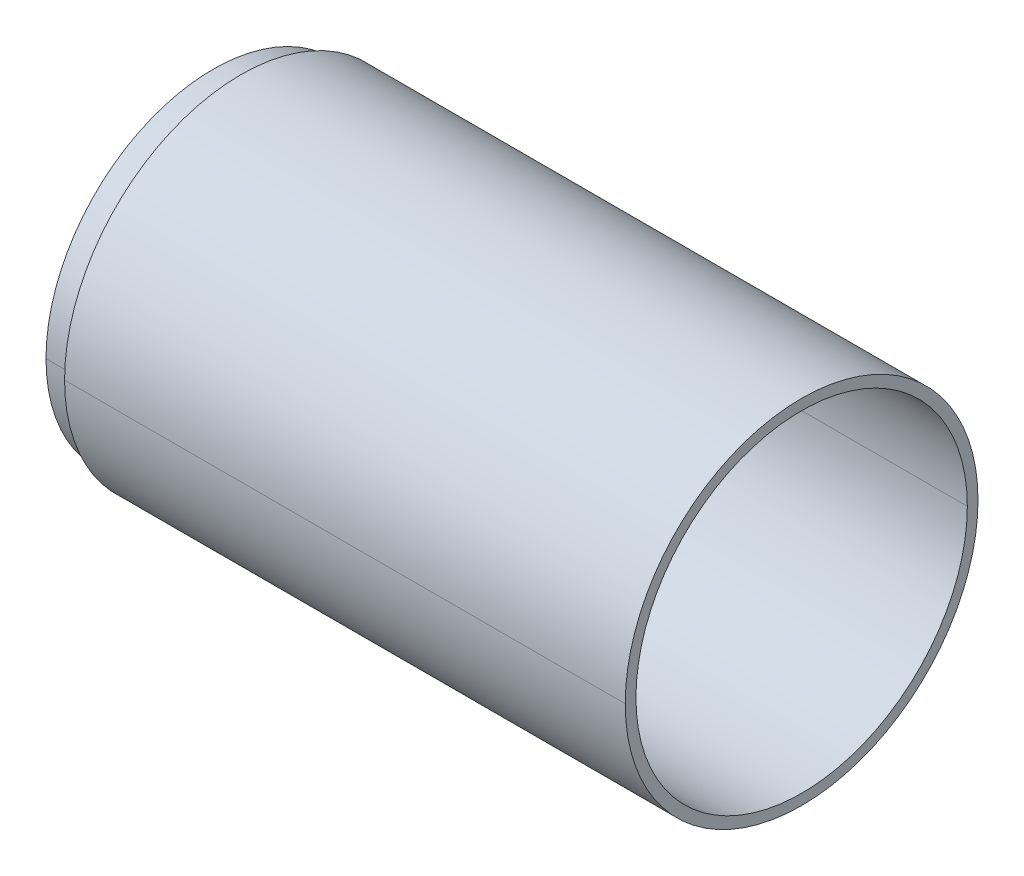
ISO-10303-21;
HEADER;
FILE_DESCRIPTION(('STEP AP214'),'2;1');
FILE_NAME('part.step','',(''),(''),'','','');
FILE_SCHEMA(('AUTOMOTIVE_DESIGN { 1 0 10303 214 1 1 1 1 }'));
ENDSEC;
DATA;
#1=APPLICATION_CONTEXT('core data for automotive mechanical design processes');
#2=APPLICATION_PROTOCOL_DEFINITION('international standard','automotive_design',2000,#1);
#3=PRODUCT_CONTEXT('',#1,'mechanical');
#4=PRODUCT('Part','Part','',(#3));
#5=PRODUCT_RELATED_PRODUCT_CATEGORY('part','',(#4));
#6=PRODUCT_DEFINITION_FORMATION('','',#4);
#7=PRODUCT_DEFINITION_CONTEXT('part definition',#1,'design');
#8=PRODUCT_DEFINITION('design','',#6,#7);
#9=PRODUCT_DEFINITION_SHAPE('','',#8);
#10=(LENGTH_UNIT() NAMED_UNIT(*) SI_UNIT(.MILLI.,.METRE.));
#11=(NAMED_UNIT(*) PLANE_ANGLE_UNIT() SI_UNIT($,.RADIAN.));
#12=(NAMED_UNIT(*) SI_UNIT($,.STERADIAN.) SOLID_ANGLE_UNIT());
#13=UNCERTAINTY_MEASURE_WITH_UNIT(LENGTH_MEASURE(1.E-05),#10,'distance_accuracy_value','');
#14=(GEOMETRIC_REPRESENTATION_CONTEXT(3) GLOBAL_UNCERTAINTY_ASSIGNED_CONTEXT((#13)) GLOBAL_UNIT_ASSIGNED_CONTEXT((#10,
#11,#12)) REPRESENTATION_CONTEXT('',''));
#15=CARTESIAN_POINT('',(0.,0.,0.));
#16=DIRECTION('',(0.,0.,1.));
#17=DIRECTION('',(1.,0.,0.));
#18=AXIS2_PLACEMENT_3D('',#15,#16,#17);
#19=CARTESIAN_POINT('',(2.05,0.,0.));
#20=DIRECTION('',(1.,0.,0.));
#21=DIRECTION('',(0.,0.,1.));
#22=AXIS2_PLACEMENT_3D('',#19,#20,#21);
#23=CYLINDRICAL_SURFACE('',#22,4.);
#24=DIRECTION('',(1.,0.,0.));
#25=VECTOR('',#24,1.);
#26=CARTESIAN_POINT('',(2.05,0.,4.));
#27=LINE('',#26,#25);
#28=CARTESIAN_POINT('',(1.6,0.,4.));
#29=VERTEX_POINT('',#28);
#30=CARTESIAN_POINT('',(13.0666666667,0.,4.));
#31=VERTEX_POINT('',#30);
#32=EDGE_CURVE('E208',#29,#31,#27,.T.);
#33=ORIENTED_EDGE('',*,*,#32,.T.);
#34=CARTESIAN_POINT('',(13.0666666667,0.,0.));
#35=DIRECTION('',(1.,0.,0.));
#36=DIRECTION('',(0.,0.,1.));
#37=AXIS2_PLACEMENT_3D('',#34,#35,#36);
#38=CIRCLE('',#37,4.);
#39=CARTESIAN_POINT('',(13.0666666667,0.,-4.));
#40=VERTEX_POINT('',#39);
#41=EDGE_CURVE('E104',#31,#40,#38,.T.);
#42=ORIENTED_EDGE('',*,*,#41,.T.);
#43=DIRECTION('',(-1.,0.,0.));
#44=VECTOR('',#43,1.);
#45=CARTESIAN_POINT('',(2.05,0.,-4.));
#46=LINE('',#45,#44);
#47=CARTESIAN_POINT('',(1.6,0.,-4.));
#48=VERTEX_POINT('',#47);
#49=EDGE_CURVE('E173',#40,#48,#46,.T.);
#50=ORIENTED_EDGE('',*,*,#49,.T.);
#51=CARTESIAN_POINT('',(1.6,0.,0.));
#52=DIRECTION('',(1.,0.,0.));
#53=DIRECTION('',(0.,0.,1.));
#54=AXIS2_PLACEMENT_3D('',#51,#52,#53);
#55=CIRCLE('',#54,4.);
#56=EDGE_CURVE('E93',#29,#48,#55,.T.);
#57=ORIENTED_EDGE('',*,*,#56,.F.);
#58=EDGE_LOOP('',(#33,#42,#50,#57));
#59=FACE_BOUND('',#58,.T.);
#60=ADVANCED_FACE('F16',(#59),#23,.F.);
#61=CARTESIAN_POINT('',(34.2,0.,6.75));
#62=DIRECTION('',(1.,0.,0.));
#63=DIRECTION('',(0.,1.,0.));
#64=AXIS2_PLACEMENT_3D('',#61,#62,#63);
#65=PLANE('',#64);
#66=CARTESIAN_POINT('',(34.2,0.,0.));
#67=DIRECTION('',(-1.,0.,0.));
#68=DIRECTION('',(0.,0.,-1.));
#69=AXIS2_PLACEMENT_3D('',#66,#67,#68);
#70=CIRCLE('',#69,8.925);
#71=CARTESIAN_POINT('',(34.2,0.,-8.925));
#72=VERTEX_POINT('',#71);
#73=CARTESIAN_POINT('',(34.2,0.,8.925));
#74=VERTEX_POINT('',#73);
#75=EDGE_CURVE('E177',#72,#74,#70,.T.);
#76=ORIENTED_EDGE('',*,*,#75,.T.);
#77=CARTESIAN_POINT('',(34.2,0.,0.));
#78=DIRECTION('',(-1.,0.,0.));
#79=DIRECTION('',(0.,0.,-1.));
#80=AXIS2_PLACEMENT_3D('',#77,#78,#79);
#81=CIRCLE('',#80,8.925);
#82=EDGE_CURVE('E41',#74,#72,#81,.T.);
#83=ORIENTED_EDGE('',*,*,#82,.T.);
#84=EDGE_LOOP('',(#76,#83));
#85=FACE_BOUND('',#84,.T.);
#86=CARTESIAN_POINT('',(34.2,0.,0.));
#87=DIRECTION('',(1.,0.,0.));
#88=DIRECTION('',(0.,0.,1.));
#89=AXIS2_PLACEMENT_3D('',#86,#87,#88);
#90=CIRCLE('',#89,9.5);
#91=CARTESIAN_POINT('',(34.2,0.,9.5));
#92=VERTEX_POINT('',#91);
#93=CARTESIAN_POINT('',(34.2,0.,-9.5));
#94=VERTEX_POINT('',#93);
#95=EDGE_CURVE('E169',#92,#94,#90,.T.);
#96=ORIENTED_EDGE('',*,*,#95,.T.);
#97=CARTESIAN_POINT('',(34.2,0.,0.));
#98=DIRECTION('',(1.,0.,0.));
#99=DIRECTION('',(0.,0.,1.));
#100=AXIS2_PLACEMENT_3D('',#97,#98,#99);
#101=CIRCLE('',#100,9.5);
#102=EDGE_CURVE('E11',#94,#92,#101,.T.);
#103=ORIENTED_EDGE('',*,*,#102,.T.);
#104=EDGE_LOOP('',(#96,#103));
#105=FACE_BOUND('',#104,.T.);
#106=ADVANCED_FACE('F240',(#85,#105),#65,.T.);
#107=CARTESIAN_POINT('',(19.1,0.,0.));
#108=DIRECTION('',(1.,0.,0.));
#109=DIRECTION('',(0.,0.,1.));
#110=AXIS2_PLACEMENT_3D('',#107,#108,#109);
#111=CYLINDRICAL_SURFACE('',#110,9.5);
#112=DIRECTION('',(1.,0.,0.));
#113=VECTOR('',#112,1.);
#114=CARTESIAN_POINT('',(19.1,0.,9.5));
#115=LINE('',#114,#113);
#116=CARTESIAN_POINT('',(4.,0.,9.5));
#117=VERTEX_POINT('',#116);
#118=EDGE_CURVE('E158',#117,#92,#115,.T.);
#119=ORIENTED_EDGE('',*,*,#118,.T.);
#120=ORIENTED_EDGE('',*,*,#102,.F.);
#121=DIRECTION('',(-1.,0.,0.));
#122=VECTOR('',#121,1.);
#123=CARTESIAN_POINT('',(19.1,0.,-9.5));
#124=LINE('',#123,#122);
#125=CARTESIAN_POINT('',(4.,0.,-9.5));
#126=VERTEX_POINT('',#125);
#127=EDGE_CURVE('E157',#94,#126,#124,.T.);
#128=ORIENTED_EDGE('',*,*,#127,.T.);
#129=CARTESIAN_POINT('',(4.,0.,0.));
#130=DIRECTION('',(1.,0.,0.));
#131=DIRECTION('',(0.,0.,1.));
#132=AXIS2_PLACEMENT_3D('',#129,#130,#131);
#133=CIRCLE('',#132,9.5);
#134=EDGE_CURVE('E27',#126,#117,#133,.T.);
#135=ORIENTED_EDGE('',*,*,#134,.T.);
#136=EDGE_LOOP('',(#119,#120,#128,#135));
#137=FACE_BOUND('',#136,.T.);
#138=ADVANCED_FACE('F18',(#137),#111,.T.);
#139=CARTESIAN_POINT('',(4.,0.,9.25));
#140=DIRECTION('',(-1.,0.,0.));
#141=DIRECTION('',(0.,0.,1.));
#142=AXIS2_PLACEMENT_3D('',#139,#140,#141);
#143=PLANE('',#142);
#144=CARTESIAN_POINT('',(4.,0.,0.));
#145=DIRECTION('',(1.,0.,0.));
#146=DIRECTION('',(0.,0.,1.));
#147=AXIS2_PLACEMENT_3D('',#144,#145,#146);
#148=CIRCLE('',#147,9.);
#149=CARTESIAN_POINT('',(4.,0.,9.));
#150=VERTEX_POINT('',#149);
#151=CARTESIAN_POINT('',(4.,0.,-9.));
#152=VERTEX_POINT('',#151);
#153=EDGE_CURVE('E140',#150,#152,#148,.T.);
#154=ORIENTED_EDGE('',*,*,#153,.T.);
#155=CARTESIAN_POINT('',(4.,0.,0.));
#156=DIRECTION('',(1.,0.,0.));
#157=DIRECTION('',(0.,0.,1.));
#158=AXIS2_PLACEMENT_3D('',#155,#156,#157);
#159=CIRCLE('',#158,9.);
#160=EDGE_CURVE('E160',#152,#150,#159,.T.);
#161=ORIENTED_EDGE('',*,*,#160,.T.);
#162=EDGE_LOOP('',(#154,#161));
#163=FACE_BOUND('',#162,.T.);
#164=CARTESIAN_POINT('',(4.,0.,0.));
#165=DIRECTION('',(1.,0.,0.));
#166=DIRECTION('',(0.,0.,1.));
#167=AXIS2_PLACEMENT_3D('',#164,#165,#166);
#168=CIRCLE('',#167,9.5);
#169=EDGE_CURVE('E153',#117,#126,#168,.T.);
#170=ORIENTED_EDGE('',*,*,#169,.F.);
#171=ORIENTED_EDGE('',*,*,#134,.F.);
#172=EDGE_LOOP('',(#170,#171));
#173=FACE_BOUND('',#172,.T.);
#174=ADVANCED_FACE('F322',(#163,#173),#143,.T.);
#175=CARTESIAN_POINT('',(3.25,0.,0.));
#176=DIRECTION('',(1.,0.,0.));
#177=DIRECTION('',(0.,0.,1.));
#178=AXIS2_PLACEMENT_3D('',#175,#176,#177);
#179=CYLINDRICAL_SURFACE('',#178,9.);
#180=DIRECTION('',(1.,0.,0.));
#181=VECTOR('',#180,1.);
#182=CARTESIAN_POINT('',(3.25,0.,9.));
#183=LINE('',#182,#181);
#184=CARTESIAN_POINT('',(2.5,0.,9.));
#185=VERTEX_POINT('',#184);
#186=EDGE_CURVE('E165',#185,#150,#183,.T.);
#187=ORIENTED_EDGE('',*,*,#186,.T.);
#188=ORIENTED_EDGE('',*,*,#160,.F.);
#189=DIRECTION('',(-1.,0.,0.));
#190=VECTOR('',#189,1.);
#191=CARTESIAN_POINT('',(3.25,0.,-9.));
#192=LINE('',#191,#190);
#193=CARTESIAN_POINT('',(2.5,0.,-9.));
#194=VERTEX_POINT('',#193);
#195=EDGE_CURVE('E147',#152,#194,#192,.T.);
#196=ORIENTED_EDGE('',*,*,#195,.T.);
#197=CARTESIAN_POINT('',(2.5,0.,0.));
#198=DIRECTION('',(1.,0.,0.));
#199=DIRECTION('',(0.,0.,1.));
#200=AXIS2_PLACEMENT_3D('',#197,#198,#199);
#201=CIRCLE('',#200,9.);
#202=EDGE_CURVE('E187',#194,#185,#201,.T.);
#203=ORIENTED_EDGE('',*,*,#202,.T.);
#204=EDGE_LOOP('',(#187,#188,#196,#203));
#205=FACE_BOUND('',#204,.T.);
#206=ADVANCED_FACE('F329',(#205),#179,.T.);
#207=CARTESIAN_POINT('',(2.5,0.,6.9));
#208=DIRECTION('',(-1.,0.,0.));
#209=DIRECTION('',(0.,0.,1.));
#210=AXIS2_PLACEMENT_3D('',#207,#208,#209);
#211=PLANE('',#210);
#212=CARTESIAN_POINT('',(2.5,0.,0.));
#213=DIRECTION('',(1.,0.,0.));
#214=DIRECTION('',(0.,0.,1.));
#215=AXIS2_PLACEMENT_3D('',#212,#213,#214);
#216=CIRCLE('',#215,4.8);
#217=CARTESIAN_POINT('',(2.5,0.,4.8));
#218=VERTEX_POINT('',#217);
#219=CARTESIAN_POINT('',(2.5,0.,-4.8));
#220=VERTEX_POINT('',#219);
#221=EDGE_CURVE('E138',#218,#220,#216,.T.);
#222=ORIENTED_EDGE('',*,*,#221,.T.);
#223=CARTESIAN_POINT('',(2.5,0.,0.));
#224=DIRECTION('',(1.,0.,0.));
#225=DIRECTION('',(0.,0.,1.));
#226=AXIS2_PLACEMENT_3D('',#223,#224,#225);
#227=CIRCLE('',#226,4.8);
#228=EDGE_CURVE('E164',#220,#218,#227,.T.);
#229=ORIENTED_EDGE('',*,*,#228,.T.);
#230=EDGE_LOOP('',(#222,#229));
#231=FACE_BOUND('',#230,.T.);
#232=CARTESIAN_POINT('',(2.5,0.,0.));
#233=DIRECTION('',(1.,0.,0.));
#234=DIRECTION('',(0.,0.,1.));
#235=AXIS2_PLACEMENT_3D('',#232,#233,#234);
#236=CIRCLE('',#235,9.);
#237=EDGE_CURVE('E151',#185,#194,#236,.T.);
#238=ORIENTED_EDGE('',*,*,#237,.F.);
#239=ORIENTED_EDGE('',*,*,#202,.F.);
#240=EDGE_LOOP('',(#238,#239));
#241=FACE_BOUND('',#240,.T.);
#242=ADVANCED_FACE('F337',(#231,#241),#211,.T.);
#243=CARTESIAN_POINT('',(2.05,0.,0.));
#244=DIRECTION('',(1.,0.,0.));
#245=DIRECTION('',(0.,0.,1.));
#246=AXIS2_PLACEMENT_3D('',#243,#244,#245);
#247=CYLINDRICAL_SURFACE('',#246,4.8);
#248=DIRECTION('',(1.,0.,0.));
#249=VECTOR('',#248,1.);
#250=CARTESIAN_POINT('',(2.05,0.,4.8));
#251=LINE('',#250,#249);
#252=CARTESIAN_POINT('',(1.6,0.,4.8));
#253=VERTEX_POINT('',#252);
#254=EDGE_CURVE('E124',#253,#218,#251,.T.);
#255=ORIENTED_EDGE('',*,*,#254,.T.);
#256=ORIENTED_EDGE('',*,*,#228,.F.);
#257=DIRECTION('',(-1.,0.,0.));
#258=VECTOR('',#257,1.);
#259=CARTESIAN_POINT('',(2.05,0.,-4.8));
#260=LINE('',#259,#258);
#261=CARTESIAN_POINT('',(1.6,0.,-4.8));
#262=VERTEX_POINT('',#261);
#263=EDGE_CURVE('E126',#220,#262,#260,.T.);
#264=ORIENTED_EDGE('',*,*,#263,.T.);
#265=CARTESIAN_POINT('',(1.6,0.,0.));
#266=DIRECTION('',(1.,0.,0.));
#267=DIRECTION('',(0.,0.,1.));
#268=AXIS2_PLACEMENT_3D('',#265,#266,#267);
#269=CIRCLE('',#268,4.8);
#270=EDGE_CURVE('E119',#262,#253,#269,.T.);
#271=ORIENTED_EDGE('',*,*,#270,.T.);
#272=EDGE_LOOP('',(#255,#256,#264,#271));
#273=FACE_BOUND('',#272,.T.);
#274=ADVANCED_FACE('F121',(#273),#247,.T.);
#275=CARTESIAN_POINT('',(1.6,0.,4.4));
#276=DIRECTION('',(-1.,0.,0.));
#277=DIRECTION('',(0.,0.,1.));
#278=AXIS2_PLACEMENT_3D('',#275,#276,#277);
#279=PLANE('',#278);
#280=ORIENTED_EDGE('',*,*,#56,.T.);
#281=CARTESIAN_POINT('',(1.6,0.,0.));
#282=DIRECTION('',(1.,0.,0.));
#283=DIRECTION('',(0.,0.,1.));
#284=AXIS2_PLACEMENT_3D('',#281,#282,#283);
#285=CIRCLE('',#284,4.);
#286=EDGE_CURVE('E205',#48,#29,#285,.T.);
#287=ORIENTED_EDGE('',*,*,#286,.T.);
#288=EDGE_LOOP('',(#280,#287));
#289=FACE_BOUND('',#288,.T.);
#290=CARTESIAN_POINT('',(1.6,0.,0.));
#291=DIRECTION('',(1.,0.,0.));
#292=DIRECTION('',(0.,0.,1.));
#293=AXIS2_PLACEMENT_3D('',#290,#291,#292);
#294=CIRCLE('',#293,4.8);
#295=EDGE_CURVE('E131',#253,#262,#294,.T.);
#296=ORIENTED_EDGE('',*,*,#295,.F.);
#297=ORIENTED_EDGE('',*,*,#270,.F.);
#298=EDGE_LOOP('',(#296,#297));
#299=FACE_BOUND('',#298,.T.);
#300=ADVANCED_FACE('F132',(#289,#299),#279,.T.);
#301=CARTESIAN_POINT('',(13.0666666667,0.,0.));
#302=DIRECTION('',(-1.,0.,0.));
#303=DIRECTION('',(0.,0.,1.));
#304=AXIS2_PLACEMENT_3D('',#301,#302,#303);
#305=PLANE('',#304);
#306=CARTESIAN_POINT('',(13.0666666667,0.,0.));
#307=DIRECTION('',(1.,0.,0.));
#308=DIRECTION('',(0.,0.,1.));
#309=AXIS2_PLACEMENT_3D('',#306,#307,#308);
#310=CIRCLE('',#309,4.);
#311=EDGE_CURVE('E170',#40,#31,#310,.T.);
#312=ORIENTED_EDGE('',*,*,#311,.F.);
#313=ORIENTED_EDGE('',*,*,#41,.F.);
#314=EDGE_LOOP('',(#312,#313));
#315=FACE_BOUND('',#314,.T.);
#316=CARTESIAN_POINT('',(13.0666666667,0.,0.));
#317=DIRECTION('',(-1.,0.,0.));
#318=DIRECTION('',(0.,0.,-1.));
#319=AXIS2_PLACEMENT_3D('',#316,#317,#318);
#320=CIRCLE('',#319,8.925);
#321=CARTESIAN_POINT('',(13.0666666667,0.,-8.925));
#322=VERTEX_POINT('',#321);
#323=CARTESIAN_POINT('',(13.0666666667,0.,8.925));
#324=VERTEX_POINT('',#323);
#325=EDGE_CURVE('E215',#322,#324,#320,.T.);
#326=ORIENTED_EDGE('',*,*,#325,.F.);
#327=CARTESIAN_POINT('',(13.0666666667,0.,0.));
#328=DIRECTION('',(-1.,0.,0.));
#329=DIRECTION('',(0.,0.,-1.));
#330=AXIS2_PLACEMENT_3D('',#327,#328,#329);
#331=CIRCLE('',#330,8.925);
#332=EDGE_CURVE('E176',#324,#322,#331,.T.);
#333=ORIENTED_EDGE('',*,*,#332,.F.);
#334=EDGE_LOOP('',(#326,#333));
#335=FACE_BOUND('',#334,.T.);
#336=ADVANCED_FACE('F235',(#315,#335),#305,.F.);
#337=CARTESIAN_POINT('',(23.63333333335,0.,0.));
#338=DIRECTION('',(-1.,0.,0.));
#339=DIRECTION('',(0.,0.,-1.));
#340=AXIS2_PLACEMENT_3D('',#337,#338,#339);
#341=CYLINDRICAL_SURFACE('',#340,8.925);
#342=DIRECTION('',(1.,0.,0.));
#343=VECTOR('',#342,1.);
#344=CARTESIAN_POINT('',(23.63333333335,0.,-8.925));
#345=LINE('',#344,#343);
#346=EDGE_CURVE('E213',#322,#72,#345,.T.);
#347=ORIENTED_EDGE('',*,*,#346,.T.);
#348=ORIENTED_EDGE('',*,*,#82,.F.);
#349=DIRECTION('',(-1.,0.,0.));
#350=VECTOR('',#349,1.);
#351=CARTESIAN_POINT('',(23.63333333335,0.,8.925));
#352=LINE('',#351,#350);
#353=EDGE_CURVE('E20',#74,#324,#352,.T.);
#354=ORIENTED_EDGE('',*,*,#353,.T.);
#355=ORIENTED_EDGE('',*,*,#332,.T.);
#356=EDGE_LOOP('',(#347,#348,#354,#355));
#357=FACE_BOUND('',#356,.T.);
#358=ADVANCED_FACE('F232',(#357),#341,.F.);
#359=CARTESIAN_POINT('',(23.63333333335,0.,0.));
#360=DIRECTION('',(-1.,0.,0.));
#361=DIRECTION('',(0.,0.,-1.));
#362=AXIS2_PLACEMENT_3D('',#359,#360,#361);
#363=CYLINDRICAL_SURFACE('',#362,8.925);
#364=ORIENTED_EDGE('',*,*,#346,.F.);
#365=ORIENTED_EDGE('',*,*,#325,.T.);
#366=ORIENTED_EDGE('',*,*,#353,.F.);
#367=ORIENTED_EDGE('',*,*,#75,.F.);
#368=EDGE_LOOP('',(#364,#365,#366,#367));
#369=FACE_BOUND('',#368,.T.);
#370=ADVANCED_FACE('F238',(#369),#363,.F.);
#371=CARTESIAN_POINT('',(2.05,0.,0.));
#372=DIRECTION('',(1.,0.,0.));
#373=DIRECTION('',(0.,0.,1.));
#374=AXIS2_PLACEMENT_3D('',#371,#372,#373);
#375=CYLINDRICAL_SURFACE('',#374,4.8);
#376=ORIENTED_EDGE('',*,*,#254,.F.);
#377=ORIENTED_EDGE('',*,*,#295,.T.);
#378=ORIENTED_EDGE('',*,*,#263,.F.);
#379=ORIENTED_EDGE('',*,*,#221,.F.);
#380=EDGE_LOOP('',(#376,#377,#378,#379));
#381=FACE_BOUND('',#380,.T.);
#382=ADVANCED_FACE('F136',(#381),#375,.T.);
#383=CARTESIAN_POINT('',(3.25,0.,0.));
#384=DIRECTION('',(1.,0.,0.));
#385=DIRECTION('',(0.,0.,1.));
#386=AXIS2_PLACEMENT_3D('',#383,#384,#385);
#387=CYLINDRICAL_SURFACE('',#386,9.);
#388=ORIENTED_EDGE('',*,*,#186,.F.);
#389=ORIENTED_EDGE('',*,*,#237,.T.);
#390=ORIENTED_EDGE('',*,*,#195,.F.);
#391=ORIENTED_EDGE('',*,*,#153,.F.);
#392=EDGE_LOOP('',(#388,#389,#390,#391));
#393=FACE_BOUND('',#392,.T.);
#394=ADVANCED_FACE('F378',(#393),#387,.T.);
#395=CARTESIAN_POINT('',(19.1,0.,0.));
#396=DIRECTION('',(1.,0.,0.));
#397=DIRECTION('',(0.,0.,1.));
#398=AXIS2_PLACEMENT_3D('',#395,#396,#397);
#399=CYLINDRICAL_SURFACE('',#398,9.5);
#400=ORIENTED_EDGE('',*,*,#118,.F.);
#401=ORIENTED_EDGE('',*,*,#169,.T.);
#402=ORIENTED_EDGE('',*,*,#127,.F.);
#403=ORIENTED_EDGE('',*,*,#95,.F.);
#404=EDGE_LOOP('',(#400,#401,#402,#403));
#405=FACE_BOUND('',#404,.T.);
#406=ADVANCED_FACE('F254',(#405),#399,.T.);
#407=CARTESIAN_POINT('',(2.05,0.,0.));
#408=DIRECTION('',(1.,0.,0.));
#409=DIRECTION('',(0.,0.,1.));
#410=AXIS2_PLACEMENT_3D('',#407,#408,#409);
#411=CYLINDRICAL_SURFACE('',#410,4.);
#412=ORIENTED_EDGE('',*,*,#32,.F.);
#413=ORIENTED_EDGE('',*,*,#286,.F.);
#414=ORIENTED_EDGE('',*,*,#49,.F.);
#415=ORIENTED_EDGE('',*,*,#311,.T.);
#416=EDGE_LOOP('',(#412,#413,#414,#415));
#417=FACE_BOUND('',#416,.T.);
#418=ADVANCED_FACE('F390',(#417),#411,.F.);
#419=CLOSED_SHELL('',(#60,#106,#138,#174,#206,#242,#274,#300,#336,#358,#370,#382,#394,#406,#418));
#420=MANIFOLD_SOLID_BREP('B1',#419);
#421=ADVANCED_BREP_SHAPE_REPRESENTATION('',(#18,#420),#14);
#422=SHAPE_DEFINITION_REPRESENTATION(#9,#421);
ENDSEC;
END-ISO-10303-21;
